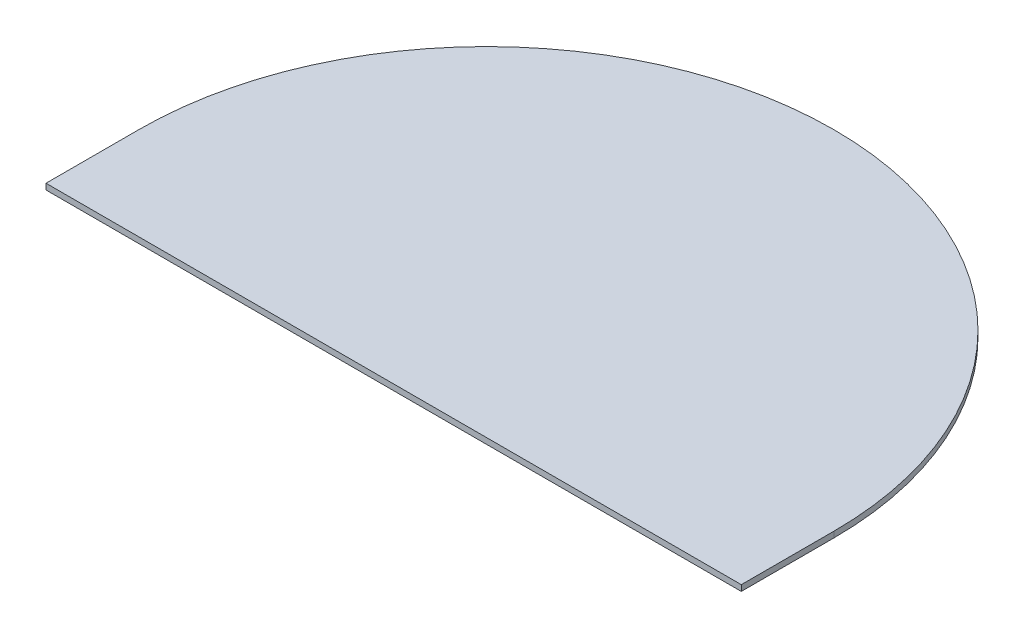
ISO-10303-21;
HEADER;
FILE_DESCRIPTION(('STEP AP214'),'2;1');
FILE_NAME('part.step','',(''),(''),'','','');
FILE_SCHEMA(('AUTOMOTIVE_DESIGN { 1 0 10303 214 1 1 1 1 }'));
ENDSEC;
DATA;
#1=APPLICATION_CONTEXT('core data for automotive mechanical design processes');
#2=APPLICATION_PROTOCOL_DEFINITION('international standard','automotive_design',2000,#1);
#3=PRODUCT_CONTEXT('',#1,'mechanical');
#4=PRODUCT('Part','Part','',(#3));
#5=PRODUCT_RELATED_PRODUCT_CATEGORY('part','',(#4));
#6=PRODUCT_DEFINITION_FORMATION('','',#4);
#7=PRODUCT_DEFINITION_CONTEXT('part definition',#1,'design');
#8=PRODUCT_DEFINITION('design','',#6,#7);
#9=PRODUCT_DEFINITION_SHAPE('','',#8);
#10=(LENGTH_UNIT() NAMED_UNIT(*) SI_UNIT(.MILLI.,.METRE.));
#11=(NAMED_UNIT(*) PLANE_ANGLE_UNIT() SI_UNIT($,.RADIAN.));
#12=(NAMED_UNIT(*) SI_UNIT($,.STERADIAN.) SOLID_ANGLE_UNIT());
#13=UNCERTAINTY_MEASURE_WITH_UNIT(LENGTH_MEASURE(1.E-05),#10,'distance_accuracy_value','');
#14=(GEOMETRIC_REPRESENTATION_CONTEXT(3) GLOBAL_UNCERTAINTY_ASSIGNED_CONTEXT((#13)) GLOBAL_UNIT_ASSIGNED_CONTEXT((#10,
#11,#12)) REPRESENTATION_CONTEXT('',''));
#15=CARTESIAN_POINT('',(0.,0.,0.));
#16=DIRECTION('',(0.,0.,1.));
#17=DIRECTION('',(1.,0.,0.));
#18=AXIS2_PLACEMENT_3D('',#15,#16,#17);
#19=CARTESIAN_POINT('',(-375.,6.35,75.));
#20=DIRECTION('',(1.,0.,0.));
#21=DIRECTION('',(0.,0.,-1.));
#22=AXIS2_PLACEMENT_3D('',#19,#20,#21);
#23=PLANE('',#22);
#24=DIRECTION('',(0.,0.,1.));
#25=VECTOR('',#24,1.);
#26=CARTESIAN_POINT('',(-375.,0.,75.));
#27=LINE('',#26,#25);
#28=CARTESIAN_POINT('',(-375.,0.,-25.));
#29=VERTEX_POINT('',#28);
#30=CARTESIAN_POINT('',(-375.,0.,75.));
#31=VERTEX_POINT('',#30);
#32=EDGE_CURVE('E95',#29,#31,#27,.T.);
#33=ORIENTED_EDGE('',*,*,#32,.T.);
#34=DIRECTION('',(0.,-1.,0.));
#35=VECTOR('',#34,1.);
#36=CARTESIAN_POINT('',(-375.,6.35,75.));
#37=LINE('',#36,#35);
#38=CARTESIAN_POINT('',(-375.,6.35,75.));
#39=VERTEX_POINT('',#38);
#40=EDGE_CURVE('E11',#39,#31,#37,.T.);
#41=ORIENTED_EDGE('',*,*,#40,.F.);
#42=DIRECTION('',(0.,0.,1.));
#43=VECTOR('',#42,1.);
#44=CARTESIAN_POINT('',(-375.,6.35,75.));
#45=LINE('',#44,#43);
#46=CARTESIAN_POINT('',(-375.,6.35,-25.));
#47=VERTEX_POINT('',#46);
#48=EDGE_CURVE('E83',#47,#39,#45,.T.);
#49=ORIENTED_EDGE('',*,*,#48,.F.);
#50=DIRECTION('',(0.,-1.,0.));
#51=VECTOR('',#50,1.);
#52=CARTESIAN_POINT('',(-375.,6.35,-25.));
#53=LINE('',#52,#51);
#54=EDGE_CURVE('E91',#47,#29,#53,.T.);
#55=ORIENTED_EDGE('',*,*,#54,.T.);
#56=EDGE_LOOP('',(#33,#41,#49,#55));
#57=FACE_BOUND('',#56,.T.);
#58=ADVANCED_FACE('F32',(#57),#23,.F.);
#59=CARTESIAN_POINT('',(-375.,6.35,75.));
#60=DIRECTION('',(0.,0.,-1.));
#61=DIRECTION('',(-1.,0.,0.));
#62=AXIS2_PLACEMENT_3D('',#59,#60,#61);
#63=PLANE('',#62);
#64=DIRECTION('',(1.,0.,0.));
#65=VECTOR('',#64,1.);
#66=CARTESIAN_POINT('',(-375.,0.,75.));
#67=LINE('',#66,#65);
#68=CARTESIAN_POINT('',(375.,0.,75.));
#69=VERTEX_POINT('',#68);
#70=EDGE_CURVE('E87',#31,#69,#67,.T.);
#71=ORIENTED_EDGE('',*,*,#70,.T.);
#72=DIRECTION('',(0.,-1.,0.));
#73=VECTOR('',#72,1.);
#74=CARTESIAN_POINT('',(375.,6.35,75.));
#75=LINE('',#74,#73);
#76=CARTESIAN_POINT('',(375.,6.35,75.));
#77=VERTEX_POINT('',#76);
#78=EDGE_CURVE('E40',#77,#69,#75,.T.);
#79=ORIENTED_EDGE('',*,*,#78,.F.);
#80=DIRECTION('',(1.,0.,0.));
#81=VECTOR('',#80,1.);
#82=CARTESIAN_POINT('',(-375.,6.35,75.));
#83=LINE('',#82,#81);
#84=EDGE_CURVE('E78',#39,#77,#83,.T.);
#85=ORIENTED_EDGE('',*,*,#84,.F.);
#86=ORIENTED_EDGE('',*,*,#40,.T.);
#87=EDGE_LOOP('',(#71,#79,#85,#86));
#88=FACE_BOUND('',#87,.T.);
#89=ADVANCED_FACE('F86',(#88),#63,.F.);
#90=CARTESIAN_POINT('',(375.,6.35,75.));
#91=DIRECTION('',(-1.,0.,0.));
#92=DIRECTION('',(0.,0.,1.));
#93=AXIS2_PLACEMENT_3D('',#90,#91,#92);
#94=PLANE('',#93);
#95=DIRECTION('',(0.,0.,-1.));
#96=VECTOR('',#95,1.);
#97=CARTESIAN_POINT('',(375.,0.,75.));
#98=LINE('',#97,#96);
#99=CARTESIAN_POINT('',(375.,0.,-25.));
#100=VERTEX_POINT('',#99);
#101=EDGE_CURVE('E65',#69,#100,#98,.T.);
#102=ORIENTED_EDGE('',*,*,#101,.T.);
#103=DIRECTION('',(0.,-1.,0.));
#104=VECTOR('',#103,1.);
#105=CARTESIAN_POINT('',(375.,6.35,-25.));
#106=LINE('',#105,#104);
#107=CARTESIAN_POINT('',(375.,6.35,-25.));
#108=VERTEX_POINT('',#107);
#109=EDGE_CURVE('E88',#108,#100,#106,.T.);
#110=ORIENTED_EDGE('',*,*,#109,.F.);
#111=DIRECTION('',(0.,0.,-1.));
#112=VECTOR('',#111,1.);
#113=CARTESIAN_POINT('',(375.,6.35,75.));
#114=LINE('',#113,#112);
#115=EDGE_CURVE('E81',#77,#108,#114,.T.);
#116=ORIENTED_EDGE('',*,*,#115,.F.);
#117=ORIENTED_EDGE('',*,*,#78,.T.);
#118=EDGE_LOOP('',(#102,#110,#116,#117));
#119=FACE_BOUND('',#118,.T.);
#120=ADVANCED_FACE('F89',(#119),#94,.F.);
#121=CARTESIAN_POINT('',(0.,6.35,-25.));
#122=DIRECTION('',(0.,-1.,0.));
#123=DIRECTION('',(0.,0.,-1.));
#124=AXIS2_PLACEMENT_3D('',#121,#122,#123);
#125=CYLINDRICAL_SURFACE('',#124,375.);
#126=CARTESIAN_POINT('',(0.,0.,-25.));
#127=DIRECTION('',(0.,1.,0.));
#128=DIRECTION('',(0.,0.,-1.));
#129=AXIS2_PLACEMENT_3D('',#126,#127,#128);
#130=CIRCLE('',#129,375.);
#131=EDGE_CURVE('E71',#100,#29,#130,.T.);
#132=ORIENTED_EDGE('',*,*,#131,.T.);
#133=ORIENTED_EDGE('',*,*,#54,.F.);
#134=CARTESIAN_POINT('',(0.,6.35,-25.));
#135=DIRECTION('',(0.,1.,0.));
#136=DIRECTION('',(0.,0.,-1.));
#137=AXIS2_PLACEMENT_3D('',#134,#135,#136);
#138=CIRCLE('',#137,375.);
#139=EDGE_CURVE('E48',#108,#47,#138,.T.);
#140=ORIENTED_EDGE('',*,*,#139,.F.);
#141=ORIENTED_EDGE('',*,*,#109,.T.);
#142=EDGE_LOOP('',(#132,#133,#140,#141));
#143=FACE_BOUND('',#142,.T.);
#144=ADVANCED_FACE('F102',(#143),#125,.T.);
#145=CARTESIAN_POINT('',(0.,6.35,-25.));
#146=DIRECTION('',(0.,-1.,0.));
#147=DIRECTION('',(0.,0.,-1.));
#148=AXIS2_PLACEMENT_3D('',#145,#146,#147);
#149=PLANE('',#148);
#150=ORIENTED_EDGE('',*,*,#48,.T.);
#151=ORIENTED_EDGE('',*,*,#84,.T.);
#152=ORIENTED_EDGE('',*,*,#115,.T.);
#153=ORIENTED_EDGE('',*,*,#139,.T.);
#154=EDGE_LOOP('',(#150,#151,#152,#153));
#155=FACE_BOUND('',#154,.T.);
#156=ADVANCED_FACE('F79',(#155),#149,.F.);
#157=CARTESIAN_POINT('',(0.,0.,-25.));
#158=DIRECTION('',(0.,-1.,0.));
#159=DIRECTION('',(0.,0.,-1.));
#160=AXIS2_PLACEMENT_3D('',#157,#158,#159);
#161=PLANE('',#160);
#162=ORIENTED_EDGE('',*,*,#32,.F.);
#163=ORIENTED_EDGE('',*,*,#131,.F.);
#164=ORIENTED_EDGE('',*,*,#101,.F.);
#165=ORIENTED_EDGE('',*,*,#70,.F.);
#166=EDGE_LOOP('',(#162,#163,#164,#165));
#167=FACE_BOUND('',#166,.T.);
#168=ADVANCED_FACE('F105',(#167),#161,.T.);
#169=CLOSED_SHELL('',(#58,#89,#120,#144,#156,#168));
#170=MANIFOLD_SOLID_BREP('B2',#169);
#171=ADVANCED_BREP_SHAPE_REPRESENTATION('',(#18,#170),#14);
#172=SHAPE_DEFINITION_REPRESENTATION(#9,#171);
ENDSEC;
END-ISO-10303-21;
